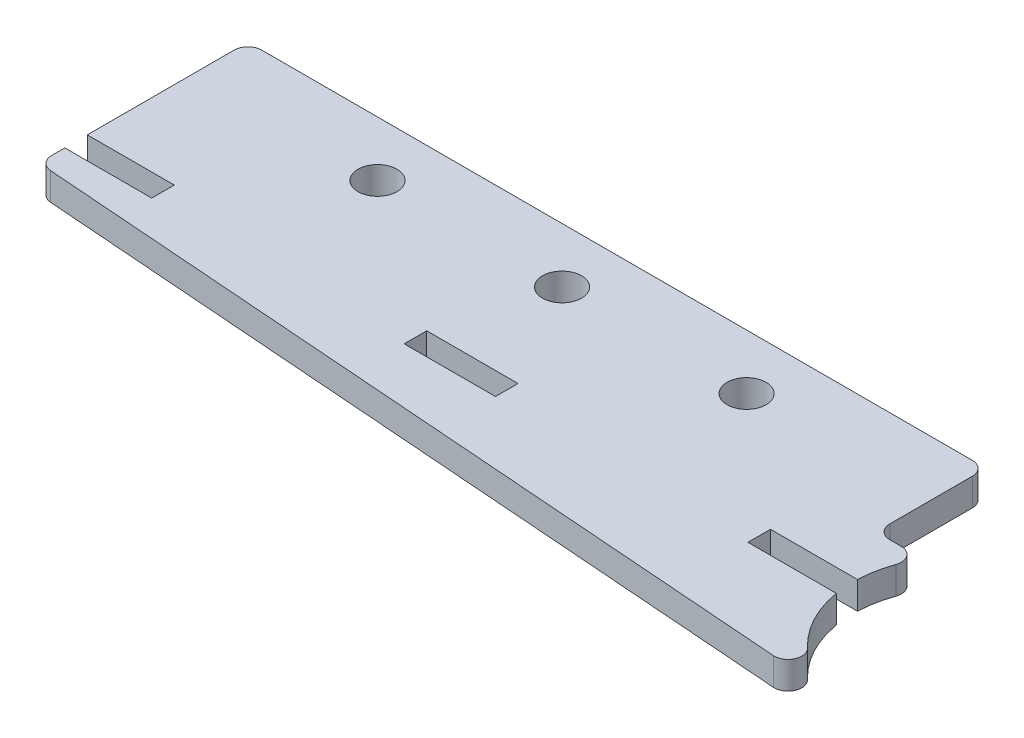
ISO-10303-21;
HEADER;
FILE_DESCRIPTION(('STEP AP214'),'2;1');
FILE_NAME('part.step','',(''),(''),'','','');
FILE_SCHEMA(('AUTOMOTIVE_DESIGN { 1 0 10303 214 1 1 1 1 }'));
ENDSEC;
DATA;
#1=APPLICATION_CONTEXT('core data for automotive mechanical design processes');
#2=APPLICATION_PROTOCOL_DEFINITION('international standard','automotive_design',2000,#1);
#3=PRODUCT_CONTEXT('',#1,'mechanical');
#4=PRODUCT('Part','Part','',(#3));
#5=PRODUCT_RELATED_PRODUCT_CATEGORY('part','',(#4));
#6=PRODUCT_DEFINITION_FORMATION('','',#4);
#7=PRODUCT_DEFINITION_CONTEXT('part definition',#1,'design');
#8=PRODUCT_DEFINITION('design','',#6,#7);
#9=PRODUCT_DEFINITION_SHAPE('','',#8);
#10=(LENGTH_UNIT() NAMED_UNIT(*) SI_UNIT(.MILLI.,.METRE.));
#11=(NAMED_UNIT(*) PLANE_ANGLE_UNIT() SI_UNIT($,.RADIAN.));
#12=(NAMED_UNIT(*) SI_UNIT($,.STERADIAN.) SOLID_ANGLE_UNIT());
#13=UNCERTAINTY_MEASURE_WITH_UNIT(LENGTH_MEASURE(1.E-05),#10,'distance_accuracy_value','');
#14=(GEOMETRIC_REPRESENTATION_CONTEXT(3) GLOBAL_UNCERTAINTY_ASSIGNED_CONTEXT((#13)) GLOBAL_UNIT_ASSIGNED_CONTEXT((#10,
#11,#12)) REPRESENTATION_CONTEXT('',''));
#15=CARTESIAN_POINT('',(0.,0.,0.));
#16=DIRECTION('',(0.,0.,1.));
#17=DIRECTION('',(1.,0.,0.));
#18=AXIS2_PLACEMENT_3D('',#15,#16,#17);
#19=CARTESIAN_POINT('',(0.,3.175,0.));
#20=DIRECTION('',(0.,-1.,0.));
#21=DIRECTION('',(0.,0.,-1.));
#22=AXIS2_PLACEMENT_3D('',#19,#20,#21);
#23=CYLINDRICAL_SURFACE('',#22,12.7);
#24=CARTESIAN_POINT('',(0.,3.175,0.));
#25=DIRECTION('',(0.,1.,0.));
#26=DIRECTION('',(0.,0.,1.));
#27=AXIS2_PLACEMENT_3D('',#24,#25,#26);
#28=CIRCLE('',#27,12.7);
#29=CARTESIAN_POINT('',(-12.6898359327455,3.175,-0.508000000000002));
#30=VERTEX_POINT('',#29);
#31=CARTESIAN_POINT('',(-11.9736748280922,3.175,-4.23333333333332));
#32=VERTEX_POINT('',#31);
#33=EDGE_CURVE('E221',#30,#32,#28,.F.);
#34=ORIENTED_EDGE('',*,*,#33,.F.);
#35=DIRECTION('',(0.,1.,0.));
#36=VECTOR('',#35,1.);
#37=CARTESIAN_POINT('',(-12.6898359327455,0.,-0.508000000000002));
#38=LINE('',#37,#36);
#39=CARTESIAN_POINT('',(-12.6898359327455,0.,-0.508000000000002));
#40=VERTEX_POINT('',#39);
#41=EDGE_CURVE('E354',#40,#30,#38,.T.);
#42=ORIENTED_EDGE('',*,*,#41,.F.);
#43=CARTESIAN_POINT('',(0.,0.,0.));
#44=DIRECTION('',(0.,1.,0.));
#45=DIRECTION('',(0.,0.,1.));
#46=AXIS2_PLACEMENT_3D('',#43,#44,#45);
#47=CIRCLE('',#46,12.7);
#48=CARTESIAN_POINT('',(-11.9736748280922,0.,-4.23333333333332));
#49=VERTEX_POINT('',#48);
#50=EDGE_CURVE('E312',#40,#49,#47,.F.);
#51=ORIENTED_EDGE('',*,*,#50,.T.);
#52=DIRECTION('',(0.,-1.,0.));
#53=VECTOR('',#52,1.);
#54=CARTESIAN_POINT('',(-11.9736748280922,3.175,-4.23333333333332));
#55=LINE('',#54,#53);
#56=EDGE_CURVE('E239',#49,#32,#55,.F.);
#57=ORIENTED_EDGE('',*,*,#56,.T.);
#58=EDGE_LOOP('',(#34,#42,#51,#57));
#59=FACE_BOUND('',#58,.T.);
#60=ADVANCED_FACE('F35',(#59),#23,.F.);
#61=CARTESIAN_POINT('',(-101.6,3.175,0.));
#62=DIRECTION('',(-1.,0.,0.));
#63=DIRECTION('',(0.,0.,1.));
#64=AXIS2_PLACEMENT_3D('',#61,#62,#63);
#65=PLANE('',#64);
#66=DIRECTION('',(0.,1.,0.));
#67=VECTOR('',#66,1.);
#68=CARTESIAN_POINT('',(-101.6,0.,-0.50799999999999));
#69=LINE('',#68,#67);
#70=CARTESIAN_POINT('',(-101.6,0.,-0.50799999999999));
#71=VERTEX_POINT('',#70);
#72=CARTESIAN_POINT('',(-101.6,3.175,-0.50799999999999));
#73=VERTEX_POINT('',#72);
#74=EDGE_CURVE('E348',#71,#73,#69,.T.);
#75=ORIENTED_EDGE('',*,*,#74,.T.);
#76=DIRECTION('',(0.,0.,-1.));
#77=VECTOR('',#76,1.);
#78=CARTESIAN_POINT('',(-101.6,3.175,0.));
#79=LINE('',#78,#77);
#80=CARTESIAN_POINT('',(-101.6,3.175,-17.4625));
#81=VERTEX_POINT('',#80);
#82=EDGE_CURVE('E321',#73,#81,#79,.T.);
#83=ORIENTED_EDGE('',*,*,#82,.T.);
#84=DIRECTION('',(0.,1.,0.));
#85=VECTOR('',#84,1.);
#86=CARTESIAN_POINT('',(-101.6,3.175,-17.4625));
#87=LINE('',#86,#85);
#88=CARTESIAN_POINT('',(-101.6,0.,-17.4625));
#89=VERTEX_POINT('',#88);
#90=EDGE_CURVE('E277',#81,#89,#87,.F.);
#91=ORIENTED_EDGE('',*,*,#90,.T.);
#92=DIRECTION('',(0.,0.,-1.));
#93=VECTOR('',#92,1.);
#94=CARTESIAN_POINT('',(-101.6,0.,0.));
#95=LINE('',#94,#93);
#96=EDGE_CURVE('E219',#71,#89,#95,.T.);
#97=ORIENTED_EDGE('',*,*,#96,.F.);
#98=EDGE_LOOP('',(#75,#83,#91,#97));
#99=FACE_BOUND('',#98,.T.);
#100=ADVANCED_FACE('F421',(#99),#65,.T.);
#101=CARTESIAN_POINT('',(-0.947172156619017,3.175,12.6289620882536));
#102=DIRECTION('',(0.0747899482416341,0.,-0.997199309888456));
#103=DIRECTION('',(-0.997199309888457,0.,-0.0747899482416341));
#104=AXIS2_PLACEMENT_3D('',#101,#102,#103);
#105=PLANE('',#104);
#106=DIRECTION('',(0.997199309888456,0.,0.0747899482416341));
#107=VECTOR('',#106,1.);
#108=CARTESIAN_POINT('',(-0.947172156619017,3.175,12.6289620882536));
#109=LINE('',#108,#107);
#110=CARTESIAN_POINT('',(-100.131229042834,3.175,5.1901578217875));
#111=VERTEX_POINT('',#110);
#112=CARTESIAN_POINT('',(-9.94599125749824,3.175,11.9540506556876));
#113=VERTEX_POINT('',#112);
#114=EDGE_CURVE('E218',#111,#113,#109,.T.);
#115=ORIENTED_EDGE('',*,*,#114,.F.);
#116=DIRECTION('',(0.,-1.,0.));
#117=VECTOR('',#116,1.);
#118=CARTESIAN_POINT('',(-100.131229042834,0.,5.19015782178749));
#119=LINE('',#118,#117);
#120=CARTESIAN_POINT('',(-100.131229042834,0.,5.1901578217875));
#121=VERTEX_POINT('',#120);
#122=EDGE_CURVE('E280',#111,#121,#119,.T.);
#123=ORIENTED_EDGE('',*,*,#122,.T.);
#124=DIRECTION('',(0.997199309888456,0.,0.0747899482416341));
#125=VECTOR('',#124,1.);
#126=CARTESIAN_POINT('',(-0.947172156619017,0.,12.6289620882536));
#127=LINE('',#126,#125);
#128=CARTESIAN_POINT('',(-9.94599125749824,0.,11.9540506556876));
#129=VERTEX_POINT('',#128);
#130=EDGE_CURVE('E316',#121,#129,#127,.T.);
#131=ORIENTED_EDGE('',*,*,#130,.T.);
#132=DIRECTION('',(0.,-1.,0.));
#133=VECTOR('',#132,1.);
#134=CARTESIAN_POINT('',(-9.94599125749824,3.175,11.9540506556876));
#135=LINE('',#134,#133);
#136=EDGE_CURVE('E247',#129,#113,#135,.F.);
#137=ORIENTED_EDGE('',*,*,#136,.T.);
#138=EDGE_LOOP('',(#115,#123,#131,#137));
#139=FACE_BOUND('',#138,.T.);
#140=ADVANCED_FACE('F444',(#139),#105,.F.);
#141=CARTESIAN_POINT('',(-8.73534419081301,0.,9.21866377887974));
#142=VERTEX_POINT('',#141);
#143=CARTESIAN_POINT('',(-12.5259282989326,0.,2.0955));
#144=VERTEX_POINT('',#143);
#145=EDGE_CURVE('E310',#142,#144,#47,.F.);
#146=ORIENTED_EDGE('',*,*,#145,.T.);
#147=DIRECTION('',(0.,1.,0.));
#148=VECTOR('',#147,1.);
#149=CARTESIAN_POINT('',(-12.5259282989326,0.,2.0955));
#150=LINE('',#149,#148);
#151=CARTESIAN_POINT('',(-12.5259282989326,3.175,2.0955));
#152=VERTEX_POINT('',#151);
#153=EDGE_CURVE('E351',#144,#152,#150,.T.);
#154=ORIENTED_EDGE('',*,*,#153,.T.);
#155=CARTESIAN_POINT('',(-8.73534419081301,3.175,9.21866377887974));
#156=VERTEX_POINT('',#155);
#157=EDGE_CURVE('E323',#156,#152,#28,.F.);
#158=ORIENTED_EDGE('',*,*,#157,.F.);
#159=DIRECTION('',(0.,-1.,0.));
#160=VECTOR('',#159,1.);
#161=CARTESIAN_POINT('',(-8.73534419081301,3.175,9.21866377887974));
#162=LINE('',#161,#160);
#163=EDGE_CURVE('E236',#156,#142,#162,.T.);
#164=ORIENTED_EDGE('',*,*,#163,.T.);
#165=EDGE_LOOP('',(#146,#154,#158,#164));
#166=FACE_BOUND('',#165,.T.);
#167=ADVANCED_FACE('F452',(#166),#23,.F.);
#168=CARTESIAN_POINT('',(0.,3.175,-6.34999999999999));
#169=DIRECTION('',(0.,0.,-1.));
#170=DIRECTION('',(-1.,0.,0.));
#171=AXIS2_PLACEMENT_3D('',#168,#169,#170);
#172=PLANE('',#171);
#173=DIRECTION('',(1.,0.,0.));
#174=VECTOR('',#173,1.);
#175=CARTESIAN_POINT('',(0.,0.,-6.34999999999999));
#176=LINE('',#175,#174);
#177=CARTESIAN_POINT('',(-14.7965,0.,-6.34999999999999));
#178=VERTEX_POINT('',#177);
#179=CARTESIAN_POINT('',(-13.4703841816037,0.,-6.34999999999999));
#180=VERTEX_POINT('',#179);
#181=EDGE_CURVE('E223',#178,#180,#176,.T.);
#182=ORIENTED_EDGE('',*,*,#181,.F.);
#183=DIRECTION('',(0.,1.,0.));
#184=VECTOR('',#183,1.);
#185=CARTESIAN_POINT('',(-14.7965,3.175,-6.34999999999999));
#186=LINE('',#185,#184);
#187=CARTESIAN_POINT('',(-14.7965,3.175,-6.34999999999999));
#188=VERTEX_POINT('',#187);
#189=EDGE_CURVE('E250',#178,#188,#186,.T.);
#190=ORIENTED_EDGE('',*,*,#189,.T.);
#191=DIRECTION('',(1.,0.,0.));
#192=VECTOR('',#191,1.);
#193=CARTESIAN_POINT('',(0.,3.175,-6.34999999999999));
#194=LINE('',#193,#192);
#195=CARTESIAN_POINT('',(-13.4703841816037,3.175,-6.34999999999999));
#196=VERTEX_POINT('',#195);
#197=EDGE_CURVE('E290',#188,#196,#194,.T.);
#198=ORIENTED_EDGE('',*,*,#197,.T.);
#199=DIRECTION('',(0.,1.,0.));
#200=VECTOR('',#199,1.);
#201=CARTESIAN_POINT('',(-13.4703841816037,0.,-6.34999999999999));
#202=LINE('',#201,#200);
#203=EDGE_CURVE('E227',#196,#180,#202,.F.);
#204=ORIENTED_EDGE('',*,*,#203,.T.);
#205=EDGE_LOOP('',(#182,#190,#198,#204));
#206=FACE_BOUND('',#205,.T.);
#207=ADVANCED_FACE('F308',(#206),#172,.T.);
#208=DIRECTION('',(0.,1.,0.));
#209=VECTOR('',#208,1.);
#210=CARTESIAN_POINT('',(-101.6,0.,2.09550000000001));
#211=LINE('',#210,#209);
#212=CARTESIAN_POINT('',(-101.6,0.,2.09550000000001));
#213=VERTEX_POINT('',#212);
#214=CARTESIAN_POINT('',(-101.6,3.175,2.09550000000001));
#215=VERTEX_POINT('',#214);
#216=EDGE_CURVE('E198',#213,#215,#211,.T.);
#217=ORIENTED_EDGE('',*,*,#216,.F.);
#218=CARTESIAN_POINT('',(-101.6,0.,3.60710391733957));
#219=VERTEX_POINT('',#218);
#220=EDGE_CURVE('E209',#219,#213,#95,.T.);
#221=ORIENTED_EDGE('',*,*,#220,.F.);
#222=DIRECTION('',(0.,-1.,0.));
#223=VECTOR('',#222,1.);
#224=CARTESIAN_POINT('',(-101.6,3.175,3.60710391733957));
#225=LINE('',#224,#223);
#226=CARTESIAN_POINT('',(-101.6,3.175,3.60710391733957));
#227=VERTEX_POINT('',#226);
#228=EDGE_CURVE('E275',#219,#227,#225,.F.);
#229=ORIENTED_EDGE('',*,*,#228,.T.);
#230=EDGE_CURVE('E212',#227,#215,#79,.T.);
#231=ORIENTED_EDGE('',*,*,#230,.T.);
#232=EDGE_LOOP('',(#217,#221,#229,#231));
#233=FACE_BOUND('',#232,.T.);
#234=ADVANCED_FACE('F208',(#233),#65,.T.);
#235=CARTESIAN_POINT('',(0.,3.175,0.));
#236=DIRECTION('',(0.,1.,0.));
#237=DIRECTION('',(0.,0.,1.));
#238=AXIS2_PLACEMENT_3D('',#235,#236,#237);
#239=PLANE('',#238);
#240=DIRECTION('',(-1.,0.,0.));
#241=VECTOR('',#240,1.);
#242=CARTESIAN_POINT('',(0.,3.175,-0.50799999999999));
#243=LINE('',#242,#241);
#244=CARTESIAN_POINT('',(-91.567,3.175,-0.50799999999999));
#245=VERTEX_POINT('',#244);
#246=EDGE_CURVE('E203',#245,#73,#243,.T.);
#247=ORIENTED_EDGE('',*,*,#246,.F.);
#248=DIRECTION('',(0.,0.,-1.));
#249=VECTOR('',#248,1.);
#250=CARTESIAN_POINT('',(-91.567,3.175,0.));
#251=LINE('',#250,#249);
#252=CARTESIAN_POINT('',(-91.567,3.175,2.09550000000001));
#253=VERTEX_POINT('',#252);
#254=EDGE_CURVE('E411',#253,#245,#251,.T.);
#255=ORIENTED_EDGE('',*,*,#254,.F.);
#256=DIRECTION('',(1.,0.,0.));
#257=VECTOR('',#256,1.);
#258=CARTESIAN_POINT('',(0.,3.175,2.09550000000001));
#259=LINE('',#258,#257);
#260=EDGE_CURVE('E383',#215,#253,#259,.T.);
#261=ORIENTED_EDGE('',*,*,#260,.F.);
#262=ORIENTED_EDGE('',*,*,#230,.F.);
#263=CARTESIAN_POINT('',(-100.0125,3.175,3.60710391733957));
#264=DIRECTION('',(0.,1.,0.));
#265=DIRECTION('',(0.,0.,1.));
#266=AXIS2_PLACEMENT_3D('',#263,#264,#265);
#267=CIRCLE('',#266,1.5875);
#268=EDGE_CURVE('E258',#227,#111,#267,.T.);
#269=ORIENTED_EDGE('',*,*,#268,.T.);
#270=ORIENTED_EDGE('',*,*,#114,.T.);
#271=CARTESIAN_POINT('',(-9.82726221466464,3.175,10.3709967512397));
#272=DIRECTION('',(0.,1.,0.));
#273=DIRECTION('',(0.,0.,1.));
#274=AXIS2_PLACEMENT_3D('',#271,#272,#273);
#275=CIRCLE('',#274,1.5875);
#276=EDGE_CURVE('E242',#113,#156,#275,.T.);
#277=ORIENTED_EDGE('',*,*,#276,.T.);
#278=ORIENTED_EDGE('',*,*,#157,.T.);
#279=DIRECTION('',(1.,0.,0.));
#280=VECTOR('',#279,1.);
#281=CARTESIAN_POINT('',(0.,3.175,2.0955));
#282=LINE('',#281,#280);
#283=CARTESIAN_POINT('',(-22.7330000000001,3.175,2.0955));
#284=VERTEX_POINT('',#283);
#285=EDGE_CURVE('E362',#284,#152,#282,.T.);
#286=ORIENTED_EDGE('',*,*,#285,.F.);
#287=DIRECTION('',(0.,0.,1.));
#288=VECTOR('',#287,1.);
#289=CARTESIAN_POINT('',(-22.7330000000001,3.175,0.));
#290=LINE('',#289,#288);
#291=CARTESIAN_POINT('',(-22.7330000000001,3.175,-0.508000000000002));
#292=VERTEX_POINT('',#291);
#293=EDGE_CURVE('E364',#292,#284,#290,.T.);
#294=ORIENTED_EDGE('',*,*,#293,.F.);
#295=DIRECTION('',(-1.,0.,0.));
#296=VECTOR('',#295,1.);
#297=CARTESIAN_POINT('',(0.,3.175,-0.508000000000002));
#298=LINE('',#297,#296);
#299=EDGE_CURVE('E358',#30,#292,#298,.T.);
#300=ORIENTED_EDGE('',*,*,#299,.F.);
#301=ORIENTED_EDGE('',*,*,#33,.T.);
#302=CARTESIAN_POINT('',(-13.4703841816037,3.175,-4.76249999999999));
#303=DIRECTION('',(0.,1.,0.));
#304=DIRECTION('',(0.,0.,1.));
#305=AXIS2_PLACEMENT_3D('',#302,#303,#304);
#306=CIRCLE('',#305,1.5875);
#307=EDGE_CURVE('E244',#32,#196,#306,.T.);
#308=ORIENTED_EDGE('',*,*,#307,.T.);
#309=ORIENTED_EDGE('',*,*,#197,.F.);
#310=CARTESIAN_POINT('',(-14.7965,3.175,-7.93749999999999));
#311=DIRECTION('',(0.,1.,0.));
#312=DIRECTION('',(0.,0.,1.));
#313=AXIS2_PLACEMENT_3D('',#310,#311,#312);
#314=CIRCLE('',#313,1.5875);
#315=CARTESIAN_POINT('',(-16.384,3.175,-7.93749999999999));
#316=VERTEX_POINT('',#315);
#317=EDGE_CURVE('E43',#188,#316,#314,.F.);
#318=ORIENTED_EDGE('',*,*,#317,.T.);
#319=DIRECTION('',(0.,0.,-1.));
#320=VECTOR('',#319,1.);
#321=CARTESIAN_POINT('',(-16.384,3.175,-6.34999999999999));
#322=LINE('',#321,#320);
#323=CARTESIAN_POINT('',(-16.384,3.175,-17.4625));
#324=VERTEX_POINT('',#323);
#325=EDGE_CURVE('E289',#316,#324,#322,.T.);
#326=ORIENTED_EDGE('',*,*,#325,.T.);
#327=CARTESIAN_POINT('',(-17.9715,3.175,-17.4625));
#328=DIRECTION('',(0.,1.,0.));
#329=DIRECTION('',(0.,0.,1.));
#330=AXIS2_PLACEMENT_3D('',#327,#328,#329);
#331=CIRCLE('',#330,1.5875);
#332=CARTESIAN_POINT('',(-17.9715,3.175,-19.05));
#333=VERTEX_POINT('',#332);
#334=EDGE_CURVE('E263',#324,#333,#331,.T.);
#335=ORIENTED_EDGE('',*,*,#334,.T.);
#336=DIRECTION('',(-1.,0.,0.));
#337=VECTOR('',#336,1.);
#338=CARTESIAN_POINT('',(-101.6,3.175,-19.05));
#339=LINE('',#338,#337);
#340=CARTESIAN_POINT('',(-100.0125,3.175,-19.05));
#341=VERTEX_POINT('',#340);
#342=EDGE_CURVE('E299',#333,#341,#339,.T.);
#343=ORIENTED_EDGE('',*,*,#342,.T.);
#344=CARTESIAN_POINT('',(-100.0125,3.175,-17.4625));
#345=DIRECTION('',(0.,1.,0.));
#346=DIRECTION('',(0.,0.,1.));
#347=AXIS2_PLACEMENT_3D('',#344,#345,#346);
#348=CIRCLE('',#347,1.5875);
#349=EDGE_CURVE('E260',#341,#81,#348,.T.);
#350=ORIENTED_EDGE('',*,*,#349,.T.);
#351=ORIENTED_EDGE('',*,*,#82,.F.);
#352=EDGE_LOOP('',(#247,#255,#261,#262,#269,#270,#277,#278,#286,#294,#300,#301,#308,#309,#318,
#326,#335,#343,#350,#351));
#353=FACE_BOUND('',#352,.T.);
#354=DIRECTION('',(0.,0.,1.));
#355=VECTOR('',#354,1.);
#356=CARTESIAN_POINT('',(-62.4204999999999,3.175,0.));
#357=LINE('',#356,#355);
#358=CARTESIAN_POINT('',(-62.4204999999999,3.175,-0.507999999999994));
#359=VERTEX_POINT('',#358);
#360=CARTESIAN_POINT('',(-62.4204999999999,3.175,2.09550000000001));
#361=VERTEX_POINT('',#360);
#362=EDGE_CURVE('E50',#359,#361,#357,.T.);
#363=ORIENTED_EDGE('',*,*,#362,.F.);
#364=DIRECTION('',(-1.,0.,0.));
#365=VECTOR('',#364,1.);
#366=CARTESIAN_POINT('',(0.,3.175,-0.507999999999994));
#367=LINE('',#366,#365);
#368=CARTESIAN_POINT('',(-51.8794999999999,3.175,-0.507999999999994));
#369=VERTEX_POINT('',#368);
#370=EDGE_CURVE('E384',#369,#359,#367,.T.);
#371=ORIENTED_EDGE('',*,*,#370,.F.);
#372=DIRECTION('',(0.,0.,-1.));
#373=VECTOR('',#372,1.);
#374=CARTESIAN_POINT('',(-51.8794999999999,3.175,0.));
#375=LINE('',#374,#373);
#376=CARTESIAN_POINT('',(-51.8794999999999,3.175,2.09550000000001));
#377=VERTEX_POINT('',#376);
#378=EDGE_CURVE('E388',#377,#369,#375,.T.);
#379=ORIENTED_EDGE('',*,*,#378,.F.);
#380=DIRECTION('',(1.,0.,0.));
#381=VECTOR('',#380,1.);
#382=CARTESIAN_POINT('',(0.,3.175,2.09550000000001));
#383=LINE('',#382,#381);
#384=EDGE_CURVE('E391',#361,#377,#383,.T.);
#385=ORIENTED_EDGE('',*,*,#384,.F.);
#386=EDGE_LOOP('',(#363,#371,#379,#385));
#387=FACE_BOUND('',#386,.T.);
#388=CARTESIAN_POINT('',(-80.296,3.175,-12.7));
#389=DIRECTION('',(0.,1.,0.));
#390=DIRECTION('',(0.,0.,1.));
#391=AXIS2_PLACEMENT_3D('',#388,#389,#390);
#392=CIRCLE('',#391,2.24999999999999);
#393=CARTESIAN_POINT('',(-80.296,3.175,-10.45));
#394=VERTEX_POINT('',#393);
#395=EDGE_CURVE('E345',#394,#394,#392,.T.);
#396=ORIENTED_EDGE('',*,*,#395,.F.);
#397=EDGE_LOOP('',(#396));
#398=FACE_BOUND('',#397,.T.);
#399=CARTESIAN_POINT('',(-58.992,3.175,-12.7));
#400=DIRECTION('',(0.,1.,0.));
#401=DIRECTION('',(0.,0.,1.));
#402=AXIS2_PLACEMENT_3D('',#399,#400,#401);
#403=CIRCLE('',#402,2.24999999999999);
#404=CARTESIAN_POINT('',(-58.992,3.175,-10.45));
#405=VERTEX_POINT('',#404);
#406=EDGE_CURVE('E339',#405,#405,#403,.T.);
#407=ORIENTED_EDGE('',*,*,#406,.F.);
#408=EDGE_LOOP('',(#407));
#409=FACE_BOUND('',#408,.T.);
#410=CARTESIAN_POINT('',(-37.688,3.175,-12.7));
#411=DIRECTION('',(0.,1.,0.));
#412=DIRECTION('',(0.,0.,1.));
#413=AXIS2_PLACEMENT_3D('',#410,#411,#412);
#414=CIRCLE('',#413,2.24999999999999);
#415=CARTESIAN_POINT('',(-37.688,3.175,-10.45));
#416=VERTEX_POINT('',#415);
#417=EDGE_CURVE('E333',#416,#416,#414,.T.);
#418=ORIENTED_EDGE('',*,*,#417,.F.);
#419=EDGE_LOOP('',(#418));
#420=FACE_BOUND('',#419,.T.);
#421=ADVANCED_FACE('F287',(#353,#387,#398,#409,#420),#239,.T.);
#422=CARTESIAN_POINT('',(0.,0.,0.));
#423=DIRECTION('',(0.,1.,0.));
#424=DIRECTION('',(0.,0.,1.));
#425=AXIS2_PLACEMENT_3D('',#422,#423,#424);
#426=PLANE('',#425);
#427=DIRECTION('',(-1.,0.,0.));
#428=VECTOR('',#427,1.);
#429=CARTESIAN_POINT('',(0.,0.,-0.507999999999994));
#430=LINE('',#429,#428);
#431=CARTESIAN_POINT('',(-51.8794999999999,0.,-0.507999999999994));
#432=VERTEX_POINT('',#431);
#433=CARTESIAN_POINT('',(-62.4204999999999,0.,-0.507999999999994));
#434=VERTEX_POINT('',#433);
#435=EDGE_CURVE('E377',#432,#434,#430,.T.);
#436=ORIENTED_EDGE('',*,*,#435,.T.);
#437=DIRECTION('',(0.,0.,1.));
#438=VECTOR('',#437,1.);
#439=CARTESIAN_POINT('',(-62.4204999999999,0.,0.));
#440=LINE('',#439,#438);
#441=CARTESIAN_POINT('',(-62.4204999999999,0.,2.09550000000001));
#442=VERTEX_POINT('',#441);
#443=EDGE_CURVE('E387',#434,#442,#440,.T.);
#444=ORIENTED_EDGE('',*,*,#443,.T.);
#445=DIRECTION('',(1.,0.,0.));
#446=VECTOR('',#445,1.);
#447=CARTESIAN_POINT('',(0.,0.,2.09550000000001));
#448=LINE('',#447,#446);
#449=CARTESIAN_POINT('',(-51.8794999999999,0.,2.09550000000001));
#450=VERTEX_POINT('',#449);
#451=EDGE_CURVE('E400',#442,#450,#448,.T.);
#452=ORIENTED_EDGE('',*,*,#451,.T.);
#453=DIRECTION('',(0.,0.,-1.));
#454=VECTOR('',#453,1.);
#455=CARTESIAN_POINT('',(-51.8794999999999,0.,0.));
#456=LINE('',#455,#454);
#457=EDGE_CURVE('E397',#450,#432,#456,.T.);
#458=ORIENTED_EDGE('',*,*,#457,.T.);
#459=EDGE_LOOP('',(#436,#444,#452,#458));
#460=FACE_BOUND('',#459,.T.);
#461=CARTESIAN_POINT('',(-80.296,0.,-12.7));
#462=DIRECTION('',(0.,1.,0.));
#463=DIRECTION('',(0.,0.,1.));
#464=AXIS2_PLACEMENT_3D('',#461,#462,#463);
#465=CIRCLE('',#464,2.25);
#466=CARTESIAN_POINT('',(-80.296,0.,-10.45));
#467=VERTEX_POINT('',#466);
#468=EDGE_CURVE('E342',#467,#467,#465,.T.);
#469=ORIENTED_EDGE('',*,*,#468,.T.);
#470=EDGE_LOOP('',(#469));
#471=FACE_BOUND('',#470,.T.);
#472=CARTESIAN_POINT('',(-58.992,0.,-12.7));
#473=DIRECTION('',(0.,1.,0.));
#474=DIRECTION('',(0.,0.,1.));
#475=AXIS2_PLACEMENT_3D('',#472,#473,#474);
#476=CIRCLE('',#475,2.25);
#477=CARTESIAN_POINT('',(-58.992,0.,-10.45));
#478=VERTEX_POINT('',#477);
#479=EDGE_CURVE('E336',#478,#478,#476,.T.);
#480=ORIENTED_EDGE('',*,*,#479,.T.);
#481=EDGE_LOOP('',(#480));
#482=FACE_BOUND('',#481,.T.);
#483=CARTESIAN_POINT('',(-37.688,0.,-12.7));
#484=DIRECTION('',(0.,1.,0.));
#485=DIRECTION('',(0.,0.,1.));
#486=AXIS2_PLACEMENT_3D('',#483,#484,#485);
#487=CIRCLE('',#486,2.25);
#488=CARTESIAN_POINT('',(-37.688,0.,-10.45));
#489=VERTEX_POINT('',#488);
#490=EDGE_CURVE('E300',#489,#489,#487,.T.);
#491=ORIENTED_EDGE('',*,*,#490,.T.);
#492=EDGE_LOOP('',(#491));
#493=FACE_BOUND('',#492,.T.);
#494=DIRECTION('',(0.,0.,-1.));
#495=VECTOR('',#494,1.);
#496=CARTESIAN_POINT('',(-91.567,0.,0.));
#497=LINE('',#496,#495);
#498=CARTESIAN_POINT('',(-91.567,0.,2.09550000000001));
#499=VERTEX_POINT('',#498);
#500=CARTESIAN_POINT('',(-91.567,0.,-0.50799999999999));
#501=VERTEX_POINT('',#500);
#502=EDGE_CURVE('E58',#499,#501,#497,.T.);
#503=ORIENTED_EDGE('',*,*,#502,.T.);
#504=DIRECTION('',(-1.,0.,0.));
#505=VECTOR('',#504,1.);
#506=CARTESIAN_POINT('',(0.,0.,-0.50799999999999));
#507=LINE('',#506,#505);
#508=EDGE_CURVE('E213',#501,#71,#507,.T.);
#509=ORIENTED_EDGE('',*,*,#508,.T.);
#510=ORIENTED_EDGE('',*,*,#96,.T.);
#511=CARTESIAN_POINT('',(-100.0125,0.,-17.4625));
#512=DIRECTION('',(0.,1.,0.));
#513=DIRECTION('',(0.,0.,1.));
#514=AXIS2_PLACEMENT_3D('',#511,#512,#513);
#515=CIRCLE('',#514,1.5875);
#516=CARTESIAN_POINT('',(-100.0125,0.,-19.05));
#517=VERTEX_POINT('',#516);
#518=EDGE_CURVE('E271',#89,#517,#515,.F.);
#519=ORIENTED_EDGE('',*,*,#518,.T.);
#520=DIRECTION('',(-1.,0.,0.));
#521=VECTOR('',#520,1.);
#522=CARTESIAN_POINT('',(-101.6,0.,-19.05));
#523=LINE('',#522,#521);
#524=CARTESIAN_POINT('',(-17.9715,0.,-19.05));
#525=VERTEX_POINT('',#524);
#526=EDGE_CURVE('E319',#525,#517,#523,.T.);
#527=ORIENTED_EDGE('',*,*,#526,.F.);
#528=CARTESIAN_POINT('',(-17.9715,0.,-17.4625));
#529=DIRECTION('',(0.,1.,0.));
#530=DIRECTION('',(0.,0.,1.));
#531=AXIS2_PLACEMENT_3D('',#528,#529,#530);
#532=CIRCLE('',#531,1.5875);
#533=CARTESIAN_POINT('',(-16.384,0.,-17.4625));
#534=VERTEX_POINT('',#533);
#535=EDGE_CURVE('E273',#525,#534,#532,.F.);
#536=ORIENTED_EDGE('',*,*,#535,.T.);
#537=DIRECTION('',(0.,0.,-1.));
#538=VECTOR('',#537,1.);
#539=CARTESIAN_POINT('',(-16.384,0.,-6.34999999999999));
#540=LINE('',#539,#538);
#541=CARTESIAN_POINT('',(-16.384,0.,-7.93749999999999));
#542=VERTEX_POINT('',#541);
#543=EDGE_CURVE('E306',#542,#534,#540,.T.);
#544=ORIENTED_EDGE('',*,*,#543,.F.);
#545=CARTESIAN_POINT('',(-14.7965,0.,-7.93749999999999));
#546=DIRECTION('',(0.,1.,0.));
#547=DIRECTION('',(0.,0.,1.));
#548=AXIS2_PLACEMENT_3D('',#545,#546,#547);
#549=CIRCLE('',#548,1.5875);
#550=EDGE_CURVE('E11',#542,#178,#549,.T.);
#551=ORIENTED_EDGE('',*,*,#550,.T.);
#552=ORIENTED_EDGE('',*,*,#181,.T.);
#553=CARTESIAN_POINT('',(-13.4703841816037,0.,-4.76249999999999));
#554=DIRECTION('',(0.,1.,0.));
#555=DIRECTION('',(0.,0.,1.));
#556=AXIS2_PLACEMENT_3D('',#553,#554,#555);
#557=CIRCLE('',#556,1.5875);
#558=EDGE_CURVE('E233',#180,#49,#557,.F.);
#559=ORIENTED_EDGE('',*,*,#558,.T.);
#560=ORIENTED_EDGE('',*,*,#50,.F.);
#561=DIRECTION('',(-1.,0.,0.));
#562=VECTOR('',#561,1.);
#563=CARTESIAN_POINT('',(0.,0.,-0.508000000000002));
#564=LINE('',#563,#562);
#565=CARTESIAN_POINT('',(-22.7330000000001,0.,-0.508000000000002));
#566=VERTEX_POINT('',#565);
#567=EDGE_CURVE('E352',#40,#566,#564,.T.);
#568=ORIENTED_EDGE('',*,*,#567,.T.);
#569=DIRECTION('',(0.,0.,1.));
#570=VECTOR('',#569,1.);
#571=CARTESIAN_POINT('',(-22.7330000000001,0.,0.));
#572=LINE('',#571,#570);
#573=CARTESIAN_POINT('',(-22.7330000000001,0.,2.0955));
#574=VERTEX_POINT('',#573);
#575=EDGE_CURVE('E361',#566,#574,#572,.T.);
#576=ORIENTED_EDGE('',*,*,#575,.T.);
#577=DIRECTION('',(1.,0.,0.));
#578=VECTOR('',#577,1.);
#579=CARTESIAN_POINT('',(0.,0.,2.0955));
#580=LINE('',#579,#578);
#581=EDGE_CURVE('E369',#574,#144,#580,.T.);
#582=ORIENTED_EDGE('',*,*,#581,.T.);
#583=ORIENTED_EDGE('',*,*,#145,.F.);
#584=CARTESIAN_POINT('',(-9.82726221466464,0.,10.3709967512397));
#585=DIRECTION('',(0.,1.,0.));
#586=DIRECTION('',(0.,0.,1.));
#587=AXIS2_PLACEMENT_3D('',#584,#585,#586);
#588=CIRCLE('',#587,1.5875);
#589=EDGE_CURVE('E230',#142,#129,#588,.F.);
#590=ORIENTED_EDGE('',*,*,#589,.T.);
#591=ORIENTED_EDGE('',*,*,#130,.F.);
#592=CARTESIAN_POINT('',(-100.0125,0.,3.60710391733957));
#593=DIRECTION('',(0.,1.,0.));
#594=DIRECTION('',(0.,0.,1.));
#595=AXIS2_PLACEMENT_3D('',#592,#593,#594);
#596=CIRCLE('',#595,1.5875);
#597=EDGE_CURVE('E217',#121,#219,#596,.F.);
#598=ORIENTED_EDGE('',*,*,#597,.T.);
#599=ORIENTED_EDGE('',*,*,#220,.T.);
#600=DIRECTION('',(1.,0.,0.));
#601=VECTOR('',#600,1.);
#602=CARTESIAN_POINT('',(0.,0.,2.09550000000001));
#603=LINE('',#602,#601);
#604=EDGE_CURVE('E194',#213,#499,#603,.T.);
#605=ORIENTED_EDGE('',*,*,#604,.T.);
#606=EDGE_LOOP('',(#503,#509,#510,#519,#527,#536,#544,#551,#552,#559,#560,#568,#576,#582,#583,
#590,#591,#598,#599,#605));
#607=FACE_BOUND('',#606,.T.);
#608=ADVANCED_FACE('F215',(#460,#471,#482,#493,#607),#426,.F.);
#609=CARTESIAN_POINT('',(-13.4703841816037,3.175,-4.76249999999999));
#610=DIRECTION('',(0.,-1.,0.));
#611=DIRECTION('',(0.,0.,-1.));
#612=AXIS2_PLACEMENT_3D('',#609,#610,#611);
#613=CYLINDRICAL_SURFACE('',#612,1.5875);
#614=ORIENTED_EDGE('',*,*,#307,.F.);
#615=ORIENTED_EDGE('',*,*,#56,.F.);
#616=ORIENTED_EDGE('',*,*,#558,.F.);
#617=ORIENTED_EDGE('',*,*,#203,.F.);
#618=EDGE_LOOP('',(#614,#615,#616,#617));
#619=FACE_BOUND('',#618,.T.);
#620=ADVANCED_FACE('F469',(#619),#613,.T.);
#621=CARTESIAN_POINT('',(-9.82726221466464,3.175,10.3709967512397));
#622=DIRECTION('',(0.,-1.,0.));
#623=DIRECTION('',(0.,0.,-1.));
#624=AXIS2_PLACEMENT_3D('',#621,#622,#623);
#625=CYLINDRICAL_SURFACE('',#624,1.5875);
#626=ORIENTED_EDGE('',*,*,#276,.F.);
#627=ORIENTED_EDGE('',*,*,#136,.F.);
#628=ORIENTED_EDGE('',*,*,#589,.F.);
#629=ORIENTED_EDGE('',*,*,#163,.F.);
#630=EDGE_LOOP('',(#626,#627,#628,#629));
#631=FACE_BOUND('',#630,.T.);
#632=ADVANCED_FACE('F449',(#631),#625,.T.);
#633=CARTESIAN_POINT('',(-101.6,0.,-19.05));
#634=DIRECTION('',(0.,0.,-1.));
#635=DIRECTION('',(-1.,0.,0.));
#636=AXIS2_PLACEMENT_3D('',#633,#634,#635);
#637=PLANE('',#636);
#638=ORIENTED_EDGE('',*,*,#342,.F.);
#639=DIRECTION('',(0.,1.,0.));
#640=VECTOR('',#639,1.);
#641=CARTESIAN_POINT('',(-17.9715,0.,-19.05));
#642=LINE('',#641,#640);
#643=EDGE_CURVE('E268',#333,#525,#642,.F.);
#644=ORIENTED_EDGE('',*,*,#643,.T.);
#645=ORIENTED_EDGE('',*,*,#526,.T.);
#646=DIRECTION('',(0.,1.,0.));
#647=VECTOR('',#646,1.);
#648=CARTESIAN_POINT('',(-100.0125,0.,-19.05));
#649=LINE('',#648,#647);
#650=EDGE_CURVE('E265',#517,#341,#649,.T.);
#651=ORIENTED_EDGE('',*,*,#650,.T.);
#652=EDGE_LOOP('',(#638,#644,#645,#651));
#653=FACE_BOUND('',#652,.T.);
#654=ADVANCED_FACE('F432',(#653),#637,.T.);
#655=CARTESIAN_POINT('',(-16.384,0.,-6.34999999999999));
#656=DIRECTION('',(1.,0.,0.));
#657=DIRECTION('',(0.,0.,-1.));
#658=AXIS2_PLACEMENT_3D('',#655,#656,#657);
#659=PLANE('',#658);
#660=ORIENTED_EDGE('',*,*,#325,.F.);
#661=DIRECTION('',(0.,1.,0.));
#662=VECTOR('',#661,1.);
#663=CARTESIAN_POINT('',(-16.384,0.,-7.93749999999999));
#664=LINE('',#663,#662);
#665=EDGE_CURVE('E256',#316,#542,#664,.F.);
#666=ORIENTED_EDGE('',*,*,#665,.T.);
#667=ORIENTED_EDGE('',*,*,#543,.T.);
#668=DIRECTION('',(0.,1.,0.));
#669=VECTOR('',#668,1.);
#670=CARTESIAN_POINT('',(-16.384,0.,-17.4625));
#671=LINE('',#670,#669);
#672=EDGE_CURVE('E253',#534,#324,#671,.T.);
#673=ORIENTED_EDGE('',*,*,#672,.T.);
#674=EDGE_LOOP('',(#660,#666,#667,#673));
#675=FACE_BOUND('',#674,.T.);
#676=ADVANCED_FACE('F295',(#675),#659,.T.);
#677=CARTESIAN_POINT('',(-14.7965,3.175,-7.93749999999999));
#678=DIRECTION('',(0.,-1.,0.));
#679=DIRECTION('',(0.,0.,-1.));
#680=AXIS2_PLACEMENT_3D('',#677,#678,#679);
#681=CYLINDRICAL_SURFACE('',#680,1.5875);
#682=ORIENTED_EDGE('',*,*,#550,.F.);
#683=ORIENTED_EDGE('',*,*,#665,.F.);
#684=ORIENTED_EDGE('',*,*,#317,.F.);
#685=ORIENTED_EDGE('',*,*,#189,.F.);
#686=EDGE_LOOP('',(#682,#683,#684,#685));
#687=FACE_BOUND('',#686,.T.);
#688=ADVANCED_FACE('F303',(#687),#681,.F.);
#689=CARTESIAN_POINT('',(-17.9715,0.,-17.4625));
#690=DIRECTION('',(0.,1.,0.));
#691=DIRECTION('',(0.,0.,1.));
#692=AXIS2_PLACEMENT_3D('',#689,#690,#691);
#693=CYLINDRICAL_SURFACE('',#692,1.5875);
#694=ORIENTED_EDGE('',*,*,#535,.F.);
#695=ORIENTED_EDGE('',*,*,#643,.F.);
#696=ORIENTED_EDGE('',*,*,#334,.F.);
#697=ORIENTED_EDGE('',*,*,#672,.F.);
#698=EDGE_LOOP('',(#694,#695,#696,#697));
#699=FACE_BOUND('',#698,.T.);
#700=ADVANCED_FACE('F435',(#699),#693,.T.);
#701=CARTESIAN_POINT('',(-100.0125,0.,-17.4625));
#702=DIRECTION('',(0.,1.,0.));
#703=DIRECTION('',(0.,0.,1.));
#704=AXIS2_PLACEMENT_3D('',#701,#702,#703);
#705=CYLINDRICAL_SURFACE('',#704,1.5875);
#706=ORIENTED_EDGE('',*,*,#518,.F.);
#707=ORIENTED_EDGE('',*,*,#90,.F.);
#708=ORIENTED_EDGE('',*,*,#349,.F.);
#709=ORIENTED_EDGE('',*,*,#650,.F.);
#710=EDGE_LOOP('',(#706,#707,#708,#709));
#711=FACE_BOUND('',#710,.T.);
#712=ADVANCED_FACE('F427',(#711),#705,.T.);
#713=CARTESIAN_POINT('',(-100.0125,3.175,3.60710391733957));
#714=DIRECTION('',(0.,1.,0.));
#715=DIRECTION('',(0.,0.,1.));
#716=AXIS2_PLACEMENT_3D('',#713,#714,#715);
#717=CYLINDRICAL_SURFACE('',#716,1.5875);
#718=ORIENTED_EDGE('',*,*,#268,.F.);
#719=ORIENTED_EDGE('',*,*,#228,.F.);
#720=ORIENTED_EDGE('',*,*,#597,.F.);
#721=ORIENTED_EDGE('',*,*,#122,.F.);
#722=EDGE_LOOP('',(#718,#719,#720,#721));
#723=FACE_BOUND('',#722,.T.);
#724=ADVANCED_FACE('F37',(#723),#717,.T.);
#725=CARTESIAN_POINT('',(-37.688,3.175,-12.7));
#726=DIRECTION('',(0.,1.,0.));
#727=DIRECTION('',(0.,0.,1.));
#728=AXIS2_PLACEMENT_3D('',#725,#726,#727);
#729=CYLINDRICAL_SURFACE('',#728,2.25);
#730=ORIENTED_EDGE('',*,*,#490,.F.);
#731=EDGE_LOOP('',(#730));
#732=FACE_BOUND('',#731,.T.);
#733=ORIENTED_EDGE('',*,*,#417,.T.);
#734=EDGE_LOOP('',(#733));
#735=FACE_BOUND('',#734,.T.);
#736=ADVANCED_FACE('F635',(#732,#735),#729,.F.);
#737=CARTESIAN_POINT('',(-58.992,3.175,-12.7));
#738=DIRECTION('',(0.,1.,0.));
#739=DIRECTION('',(0.,0.,1.));
#740=AXIS2_PLACEMENT_3D('',#737,#738,#739);
#741=CYLINDRICAL_SURFACE('',#740,2.25);
#742=ORIENTED_EDGE('',*,*,#479,.F.);
#743=EDGE_LOOP('',(#742));
#744=FACE_BOUND('',#743,.T.);
#745=ORIENTED_EDGE('',*,*,#406,.T.);
#746=EDGE_LOOP('',(#745));
#747=FACE_BOUND('',#746,.T.);
#748=ADVANCED_FACE('F631',(#744,#747),#741,.F.);
#749=CARTESIAN_POINT('',(-80.296,3.175,-12.7));
#750=DIRECTION('',(0.,1.,0.));
#751=DIRECTION('',(0.,0.,1.));
#752=AXIS2_PLACEMENT_3D('',#749,#750,#751);
#753=CYLINDRICAL_SURFACE('',#752,2.25);
#754=ORIENTED_EDGE('',*,*,#468,.F.);
#755=EDGE_LOOP('',(#754));
#756=FACE_BOUND('',#755,.T.);
#757=ORIENTED_EDGE('',*,*,#395,.T.);
#758=EDGE_LOOP('',(#757));
#759=FACE_BOUND('',#758,.T.);
#760=ADVANCED_FACE('F545',(#756,#759),#753,.F.);
#761=CARTESIAN_POINT('',(-22.7330000000001,0.,0.));
#762=DIRECTION('',(-1.,0.,0.));
#763=DIRECTION('',(0.,0.,1.));
#764=AXIS2_PLACEMENT_3D('',#761,#762,#763);
#765=PLANE('',#764);
#766=ORIENTED_EDGE('',*,*,#293,.T.);
#767=DIRECTION('',(0.,1.,0.));
#768=VECTOR('',#767,1.);
#769=CARTESIAN_POINT('',(-22.7330000000001,0.,2.0955));
#770=LINE('',#769,#768);
#771=EDGE_CURVE('E349',#574,#284,#770,.T.);
#772=ORIENTED_EDGE('',*,*,#771,.F.);
#773=ORIENTED_EDGE('',*,*,#575,.F.);
#774=DIRECTION('',(0.,1.,0.));
#775=VECTOR('',#774,1.);
#776=CARTESIAN_POINT('',(-22.7330000000001,0.,-0.508000000000002));
#777=LINE('',#776,#775);
#778=EDGE_CURVE('E356',#566,#292,#777,.T.);
#779=ORIENTED_EDGE('',*,*,#778,.T.);
#780=EDGE_LOOP('',(#766,#772,#773,#779));
#781=FACE_BOUND('',#780,.T.);
#782=ADVANCED_FACE('F459',(#781),#765,.F.);
#783=CARTESIAN_POINT('',(0.,0.,-0.508000000000002));
#784=DIRECTION('',(0.,0.,-1.));
#785=DIRECTION('',(-1.,0.,0.));
#786=AXIS2_PLACEMENT_3D('',#783,#784,#785);
#787=PLANE('',#786);
#788=ORIENTED_EDGE('',*,*,#299,.T.);
#789=ORIENTED_EDGE('',*,*,#778,.F.);
#790=ORIENTED_EDGE('',*,*,#567,.F.);
#791=ORIENTED_EDGE('',*,*,#41,.T.);
#792=EDGE_LOOP('',(#788,#789,#790,#791));
#793=FACE_BOUND('',#792,.T.);
#794=ADVANCED_FACE('F544',(#793),#787,.F.);
#795=CARTESIAN_POINT('',(0.,0.,2.0955));
#796=DIRECTION('',(0.,0.,1.));
#797=DIRECTION('',(1.,0.,0.));
#798=AXIS2_PLACEMENT_3D('',#795,#796,#797);
#799=PLANE('',#798);
#800=ORIENTED_EDGE('',*,*,#285,.T.);
#801=ORIENTED_EDGE('',*,*,#153,.F.);
#802=ORIENTED_EDGE('',*,*,#581,.F.);
#803=ORIENTED_EDGE('',*,*,#771,.T.);
#804=EDGE_LOOP('',(#800,#801,#802,#803));
#805=FACE_BOUND('',#804,.T.);
#806=ADVANCED_FACE('F455',(#805),#799,.F.);
#807=CARTESIAN_POINT('',(-62.4204999999999,0.,0.));
#808=DIRECTION('',(-1.,0.,0.));
#809=DIRECTION('',(0.,0.,1.));
#810=AXIS2_PLACEMENT_3D('',#807,#808,#809);
#811=PLANE('',#810);
#812=ORIENTED_EDGE('',*,*,#362,.T.);
#813=DIRECTION('',(0.,1.,0.));
#814=VECTOR('',#813,1.);
#815=CARTESIAN_POINT('',(-62.4204999999999,0.,2.09550000000001));
#816=LINE('',#815,#814);
#817=EDGE_CURVE('E374',#442,#361,#816,.T.);
#818=ORIENTED_EDGE('',*,*,#817,.F.);
#819=ORIENTED_EDGE('',*,*,#443,.F.);
#820=DIRECTION('',(0.,1.,0.));
#821=VECTOR('',#820,1.);
#822=CARTESIAN_POINT('',(-62.4204999999999,0.,-0.507999999999994));
#823=LINE('',#822,#821);
#824=EDGE_CURVE('E381',#434,#359,#823,.T.);
#825=ORIENTED_EDGE('',*,*,#824,.T.);
#826=EDGE_LOOP('',(#812,#818,#819,#825));
#827=FACE_BOUND('',#826,.T.);
#828=ADVANCED_FACE('F563',(#827),#811,.F.);
#829=CARTESIAN_POINT('',(0.,0.,-0.507999999999994));
#830=DIRECTION('',(0.,0.,-1.));
#831=DIRECTION('',(-1.,0.,0.));
#832=AXIS2_PLACEMENT_3D('',#829,#830,#831);
#833=PLANE('',#832);
#834=ORIENTED_EDGE('',*,*,#370,.T.);
#835=ORIENTED_EDGE('',*,*,#824,.F.);
#836=ORIENTED_EDGE('',*,*,#435,.F.);
#837=DIRECTION('',(0.,1.,0.));
#838=VECTOR('',#837,1.);
#839=CARTESIAN_POINT('',(-51.8794999999999,0.,-0.507999999999994));
#840=LINE('',#839,#838);
#841=EDGE_CURVE('E379',#432,#369,#840,.T.);
#842=ORIENTED_EDGE('',*,*,#841,.T.);
#843=EDGE_LOOP('',(#834,#835,#836,#842));
#844=FACE_BOUND('',#843,.T.);
#845=ADVANCED_FACE('F572',(#844),#833,.F.);
#846=CARTESIAN_POINT('',(-51.8794999999999,0.,0.));
#847=DIRECTION('',(1.,0.,0.));
#848=DIRECTION('',(0.,0.,-1.));
#849=AXIS2_PLACEMENT_3D('',#846,#847,#848);
#850=PLANE('',#849);
#851=ORIENTED_EDGE('',*,*,#378,.T.);
#852=ORIENTED_EDGE('',*,*,#841,.F.);
#853=ORIENTED_EDGE('',*,*,#457,.F.);
#854=DIRECTION('',(0.,1.,0.));
#855=VECTOR('',#854,1.);
#856=CARTESIAN_POINT('',(-51.8794999999999,0.,2.09550000000001));
#857=LINE('',#856,#855);
#858=EDGE_CURVE('E376',#450,#377,#857,.T.);
#859=ORIENTED_EDGE('',*,*,#858,.T.);
#860=EDGE_LOOP('',(#851,#852,#853,#859));
#861=FACE_BOUND('',#860,.T.);
#862=ADVANCED_FACE('F581',(#861),#850,.F.);
#863=CARTESIAN_POINT('',(0.,0.,2.09550000000001));
#864=DIRECTION('',(0.,0.,1.));
#865=DIRECTION('',(1.,0.,0.));
#866=AXIS2_PLACEMENT_3D('',#863,#864,#865);
#867=PLANE('',#866);
#868=ORIENTED_EDGE('',*,*,#384,.T.);
#869=ORIENTED_EDGE('',*,*,#858,.F.);
#870=ORIENTED_EDGE('',*,*,#451,.F.);
#871=ORIENTED_EDGE('',*,*,#817,.T.);
#872=EDGE_LOOP('',(#868,#869,#870,#871));
#873=FACE_BOUND('',#872,.T.);
#874=ADVANCED_FACE('F591',(#873),#867,.F.);
#875=CARTESIAN_POINT('',(0.,0.,-0.50799999999999));
#876=DIRECTION('',(0.,0.,-1.));
#877=DIRECTION('',(-1.,0.,0.));
#878=AXIS2_PLACEMENT_3D('',#875,#876,#877);
#879=PLANE('',#878);
#880=ORIENTED_EDGE('',*,*,#246,.T.);
#881=ORIENTED_EDGE('',*,*,#74,.F.);
#882=ORIENTED_EDGE('',*,*,#508,.F.);
#883=DIRECTION('',(0.,1.,0.));
#884=VECTOR('',#883,1.);
#885=CARTESIAN_POINT('',(-91.567,0.,-0.50799999999999));
#886=LINE('',#885,#884);
#887=EDGE_CURVE('E406',#501,#245,#886,.T.);
#888=ORIENTED_EDGE('',*,*,#887,.T.);
#889=EDGE_LOOP('',(#880,#881,#882,#888));
#890=FACE_BOUND('',#889,.T.);
#891=ADVANCED_FACE('F437',(#890),#879,.F.);
#892=CARTESIAN_POINT('',(-91.567,0.,0.));
#893=DIRECTION('',(1.,0.,0.));
#894=DIRECTION('',(0.,0.,-1.));
#895=AXIS2_PLACEMENT_3D('',#892,#893,#894);
#896=PLANE('',#895);
#897=ORIENTED_EDGE('',*,*,#254,.T.);
#898=ORIENTED_EDGE('',*,*,#887,.F.);
#899=ORIENTED_EDGE('',*,*,#502,.F.);
#900=DIRECTION('',(0.,1.,0.));
#901=VECTOR('',#900,1.);
#902=CARTESIAN_POINT('',(-91.567,0.,2.09550000000001));
#903=LINE('',#902,#901);
#904=EDGE_CURVE('E200',#499,#253,#903,.T.);
#905=ORIENTED_EDGE('',*,*,#904,.T.);
#906=EDGE_LOOP('',(#897,#898,#899,#905));
#907=FACE_BOUND('',#906,.T.);
#908=ADVANCED_FACE('F438',(#907),#896,.F.);
#909=CARTESIAN_POINT('',(0.,0.,2.09550000000001));
#910=DIRECTION('',(0.,0.,1.));
#911=DIRECTION('',(1.,0.,0.));
#912=AXIS2_PLACEMENT_3D('',#909,#910,#911);
#913=PLANE('',#912);
#914=ORIENTED_EDGE('',*,*,#260,.T.);
#915=ORIENTED_EDGE('',*,*,#904,.F.);
#916=ORIENTED_EDGE('',*,*,#604,.F.);
#917=ORIENTED_EDGE('',*,*,#216,.T.);
#918=EDGE_LOOP('',(#914,#915,#916,#917));
#919=FACE_BOUND('',#918,.T.);
#920=ADVANCED_FACE('F197',(#919),#913,.F.);
#921=CLOSED_SHELL('',(#60,#100,#140,#167,#207,#234,#421,#608,#620,#632,#654,#676,#688,#700,#712,
#724,#736,#748,#760,#782,#794,#806,#828,#845,#862,#874,#891,#908,#920));
#922=MANIFOLD_SOLID_BREP('B2',#921);
#923=ADVANCED_BREP_SHAPE_REPRESENTATION('',(#18,#922),#14);
#924=SHAPE_DEFINITION_REPRESENTATION(#9,#923);
ENDSEC;
END-ISO-10303-21;
